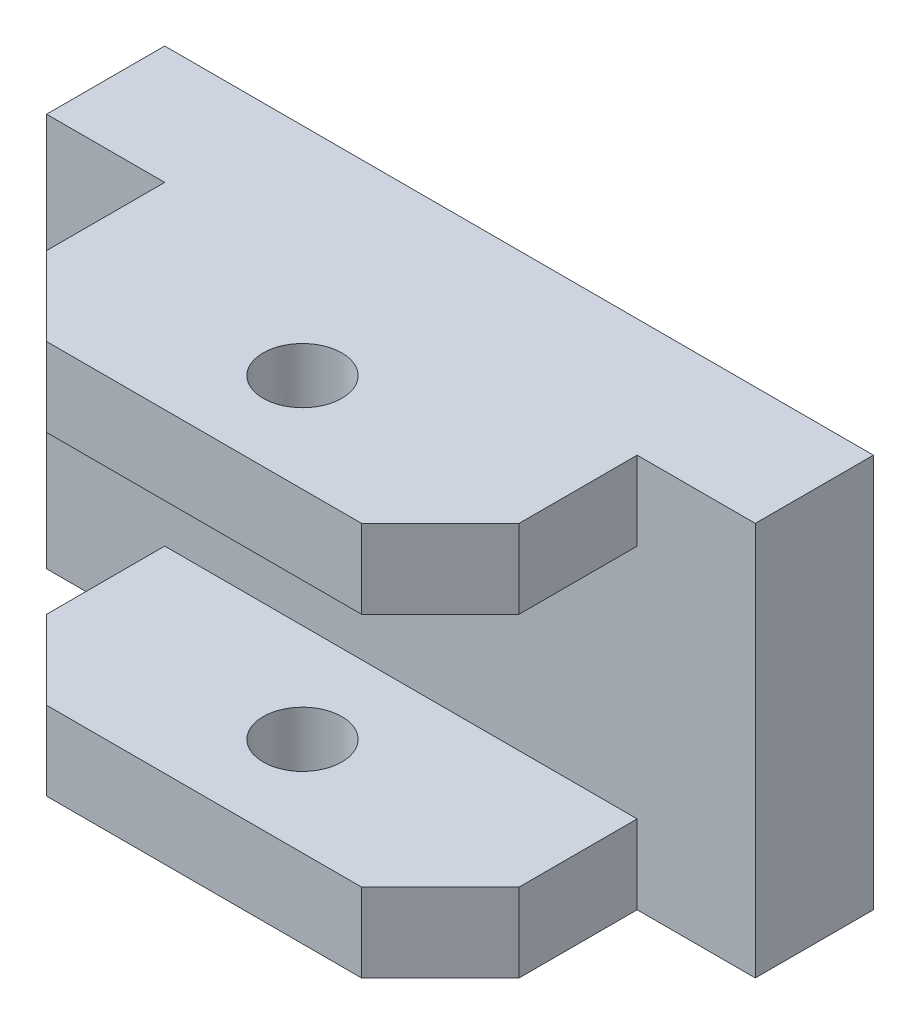
ISO-10303-21;
HEADER;
FILE_DESCRIPTION(('STEP AP214'),'2;1');
FILE_NAME('part.step','',(''),(''),'','','');
FILE_SCHEMA(('AUTOMOTIVE_DESIGN { 1 0 10303 214 1 1 1 1 }'));
ENDSEC;
DATA;
#1=APPLICATION_CONTEXT('core data for automotive mechanical design processes');
#2=APPLICATION_PROTOCOL_DEFINITION('international standard','automotive_design',2000,#1);
#3=PRODUCT_CONTEXT('',#1,'mechanical');
#4=PRODUCT('Part','Part','',(#3));
#5=PRODUCT_RELATED_PRODUCT_CATEGORY('part','',(#4));
#6=PRODUCT_DEFINITION_FORMATION('','',#4);
#7=PRODUCT_DEFINITION_CONTEXT('part definition',#1,'design');
#8=PRODUCT_DEFINITION('design','',#6,#7);
#9=PRODUCT_DEFINITION_SHAPE('','',#8);
#10=(LENGTH_UNIT() NAMED_UNIT(*) SI_UNIT(.MILLI.,.METRE.));
#11=(NAMED_UNIT(*) PLANE_ANGLE_UNIT() SI_UNIT($,.RADIAN.));
#12=(NAMED_UNIT(*) SI_UNIT($,.STERADIAN.) SOLID_ANGLE_UNIT());
#13=UNCERTAINTY_MEASURE_WITH_UNIT(LENGTH_MEASURE(1.E-05),#10,'distance_accuracy_value','');
#14=(GEOMETRIC_REPRESENTATION_CONTEXT(3) GLOBAL_UNCERTAINTY_ASSIGNED_CONTEXT((#13)) GLOBAL_UNIT_ASSIGNED_CONTEXT((#10,
#11,#12)) REPRESENTATION_CONTEXT('',''));
#15=CARTESIAN_POINT('',(0.,0.,0.));
#16=DIRECTION('',(0.,0.,1.));
#17=DIRECTION('',(1.,0.,0.));
#18=AXIS2_PLACEMENT_3D('',#15,#16,#17);
#19=CARTESIAN_POINT('',(0.,0.,15.));
#20=DIRECTION('',(0.,0.,-1.));
#21=DIRECTION('',(-1.,0.,0.));
#22=AXIS2_PLACEMENT_3D('',#19,#20,#21);
#23=PLANE('',#22);
#24=DIRECTION('',(0.,-1.,0.));
#25=VECTOR('',#24,1.);
#26=CARTESIAN_POINT('',(-30.,25.,15.));
#27=LINE('',#26,#25);
#28=CARTESIAN_POINT('',(-30.,25.,15.));
#29=VERTEX_POINT('',#28);
#30=CARTESIAN_POINT('',(-30.,15.,15.));
#31=VERTEX_POINT('',#30);
#32=EDGE_CURVE('E184',#29,#31,#27,.T.);
#33=ORIENTED_EDGE('',*,*,#32,.F.);
#34=DIRECTION('',(-1.,0.,0.));
#35=VECTOR('',#34,1.);
#36=CARTESIAN_POINT('',(-45.,25.,15.));
#37=LINE('',#36,#35);
#38=CARTESIAN_POINT('',(-45.,25.,15.));
#39=VERTEX_POINT('',#38);
#40=EDGE_CURVE('E221',#29,#39,#37,.T.);
#41=ORIENTED_EDGE('',*,*,#40,.T.);
#42=DIRECTION('',(0.,-1.,0.));
#43=VECTOR('',#42,1.);
#44=CARTESIAN_POINT('',(-45.,-25.,15.));
#45=LINE('',#44,#43);
#46=CARTESIAN_POINT('',(-45.,-25.,15.));
#47=VERTEX_POINT('',#46);
#48=EDGE_CURVE('E224',#39,#47,#45,.T.);
#49=ORIENTED_EDGE('',*,*,#48,.T.);
#50=DIRECTION('',(1.,0.,0.));
#51=VECTOR('',#50,1.);
#52=CARTESIAN_POINT('',(-45.,-25.,15.));
#53=LINE('',#52,#51);
#54=CARTESIAN_POINT('',(-30.,-25.,15.));
#55=VERTEX_POINT('',#54);
#56=EDGE_CURVE('E227',#47,#55,#53,.T.);
#57=ORIENTED_EDGE('',*,*,#56,.T.);
#58=DIRECTION('',(0.,-1.,0.));
#59=VECTOR('',#58,1.);
#60=CARTESIAN_POINT('',(-30.,-25.,15.));
#61=LINE('',#60,#59);
#62=CARTESIAN_POINT('',(-30.,-15.,15.));
#63=VERTEX_POINT('',#62);
#64=EDGE_CURVE('E206',#63,#55,#61,.T.);
#65=ORIENTED_EDGE('',*,*,#64,.F.);
#66=DIRECTION('',(-1.,0.,0.));
#67=VECTOR('',#66,1.);
#68=CARTESIAN_POINT('',(-30.,-15.,15.));
#69=LINE('',#68,#67);
#70=CARTESIAN_POINT('',(30.,-15.,15.));
#71=VERTEX_POINT('',#70);
#72=EDGE_CURVE('E209',#71,#63,#69,.T.);
#73=ORIENTED_EDGE('',*,*,#72,.F.);
#74=DIRECTION('',(0.,1.,0.));
#75=VECTOR('',#74,1.);
#76=CARTESIAN_POINT('',(30.,-15.,15.));
#77=LINE('',#76,#75);
#78=CARTESIAN_POINT('',(30.,-25.,15.));
#79=VERTEX_POINT('',#78);
#80=EDGE_CURVE('E186',#79,#71,#77,.T.);
#81=ORIENTED_EDGE('',*,*,#80,.F.);
#82=CARTESIAN_POINT('',(45.,-25.,15.));
#83=VERTEX_POINT('',#82);
#84=EDGE_CURVE('E226',#79,#83,#53,.T.);
#85=ORIENTED_EDGE('',*,*,#84,.T.);
#86=DIRECTION('',(0.,1.,0.));
#87=VECTOR('',#86,1.);
#88=CARTESIAN_POINT('',(45.,-25.,15.));
#89=LINE('',#88,#87);
#90=CARTESIAN_POINT('',(45.,25.,15.));
#91=VERTEX_POINT('',#90);
#92=EDGE_CURVE('E219',#83,#91,#89,.T.);
#93=ORIENTED_EDGE('',*,*,#92,.T.);
#94=CARTESIAN_POINT('',(30.,25.,15.));
#95=VERTEX_POINT('',#94);
#96=EDGE_CURVE('E178',#91,#95,#37,.T.);
#97=ORIENTED_EDGE('',*,*,#96,.T.);
#98=DIRECTION('',(0.,1.,0.));
#99=VECTOR('',#98,1.);
#100=CARTESIAN_POINT('',(30.,25.,15.));
#101=LINE('',#100,#99);
#102=CARTESIAN_POINT('',(30.,15.,15.));
#103=VERTEX_POINT('',#102);
#104=EDGE_CURVE('E163',#103,#95,#101,.T.);
#105=ORIENTED_EDGE('',*,*,#104,.F.);
#106=DIRECTION('',(1.,0.,0.));
#107=VECTOR('',#106,1.);
#108=CARTESIAN_POINT('',(-30.,15.,15.));
#109=LINE('',#108,#107);
#110=EDGE_CURVE('E175',#31,#103,#109,.T.);
#111=ORIENTED_EDGE('',*,*,#110,.F.);
#112=EDGE_LOOP('',(#33,#41,#49,#57,#65,#73,#81,#85,#93,#97,#105,#111));
#113=FACE_BOUND('',#112,.T.);
#114=ADVANCED_FACE('F45',(#113),#23,.F.);
#115=CARTESIAN_POINT('',(45.,-25.,15.));
#116=DIRECTION('',(-1.,0.,0.));
#117=DIRECTION('',(0.,0.,1.));
#118=AXIS2_PLACEMENT_3D('',#115,#116,#117);
#119=PLANE('',#118);
#120=DIRECTION('',(0.,1.,0.));
#121=VECTOR('',#120,1.);
#122=CARTESIAN_POINT('',(45.,-25.,0.));
#123=LINE('',#122,#121);
#124=CARTESIAN_POINT('',(45.,-25.,0.));
#125=VERTEX_POINT('',#124);
#126=CARTESIAN_POINT('',(45.,25.,0.));
#127=VERTEX_POINT('',#126);
#128=EDGE_CURVE('E195',#125,#127,#123,.T.);
#129=ORIENTED_EDGE('',*,*,#128,.T.);
#130=DIRECTION('',(0.,0.,-1.));
#131=VECTOR('',#130,1.);
#132=CARTESIAN_POINT('',(45.,25.,15.));
#133=LINE('',#132,#131);
#134=EDGE_CURVE('E246',#91,#127,#133,.T.);
#135=ORIENTED_EDGE('',*,*,#134,.F.);
#136=ORIENTED_EDGE('',*,*,#92,.F.);
#137=DIRECTION('',(0.,0.,-1.));
#138=VECTOR('',#137,1.);
#139=CARTESIAN_POINT('',(45.,-25.,15.));
#140=LINE('',#139,#138);
#141=EDGE_CURVE('E230',#83,#125,#140,.T.);
#142=ORIENTED_EDGE('',*,*,#141,.T.);
#143=EDGE_LOOP('',(#129,#135,#136,#142));
#144=FACE_BOUND('',#143,.T.);
#145=ADVANCED_FACE('F317',(#144),#119,.F.);
#146=CARTESIAN_POINT('',(-45.,25.,15.));
#147=DIRECTION('',(0.,-1.,0.));
#148=DIRECTION('',(0.,0.,-1.));
#149=AXIS2_PLACEMENT_3D('',#146,#147,#148);
#150=PLANE('',#149);
#151=CARTESIAN_POINT('',(0.,25.,27.5));
#152=DIRECTION('',(0.,-1.,0.));
#153=DIRECTION('',(0.,0.,-1.));
#154=AXIS2_PLACEMENT_3D('',#151,#152,#153);
#155=CIRCLE('',#154,5.);
#156=CARTESIAN_POINT('',(0.,25.,22.5));
#157=VERTEX_POINT('',#156);
#158=EDGE_CURVE('E253',#157,#157,#155,.T.);
#159=ORIENTED_EDGE('',*,*,#158,.T.);
#160=EDGE_LOOP('',(#159));
#161=FACE_BOUND('',#160,.T.);
#162=DIRECTION('',(0.,0.,-1.));
#163=VECTOR('',#162,1.);
#164=CARTESIAN_POINT('',(-30.,25.,40.));
#165=LINE('',#164,#163);
#166=CARTESIAN_POINT('',(-30.,25.,30.));
#167=VERTEX_POINT('',#166);
#168=EDGE_CURVE('E190',#167,#29,#165,.T.);
#169=ORIENTED_EDGE('',*,*,#168,.F.);
#170=DIRECTION('',(0.707106781186548,0.,0.707106781186548));
#171=VECTOR('',#170,1.);
#172=CARTESIAN_POINT('',(-20.,25.,40.));
#173=LINE('',#172,#171);
#174=CARTESIAN_POINT('',(-20.,25.,40.));
#175=VERTEX_POINT('',#174);
#176=EDGE_CURVE('E267',#167,#175,#173,.T.);
#177=ORIENTED_EDGE('',*,*,#176,.T.);
#178=DIRECTION('',(-1.,0.,0.));
#179=VECTOR('',#178,1.);
#180=CARTESIAN_POINT('',(-30.,25.,40.));
#181=LINE('',#180,#179);
#182=CARTESIAN_POINT('',(20.,25.,40.));
#183=VERTEX_POINT('',#182);
#184=EDGE_CURVE('E192',#183,#175,#181,.T.);
#185=ORIENTED_EDGE('',*,*,#184,.F.);
#186=DIRECTION('',(0.707106781186548,0.,-0.707106781186548));
#187=VECTOR('',#186,1.);
#188=CARTESIAN_POINT('',(20.,25.,40.));
#189=LINE('',#188,#187);
#190=CARTESIAN_POINT('',(30.,25.,30.));
#191=VERTEX_POINT('',#190);
#192=EDGE_CURVE('E265',#183,#191,#189,.T.);
#193=ORIENTED_EDGE('',*,*,#192,.T.);
#194=DIRECTION('',(0.,0.,-1.));
#195=VECTOR('',#194,1.);
#196=CARTESIAN_POINT('',(30.,25.,40.));
#197=LINE('',#196,#195);
#198=EDGE_CURVE('E169',#191,#95,#197,.T.);
#199=ORIENTED_EDGE('',*,*,#198,.T.);
#200=ORIENTED_EDGE('',*,*,#96,.F.);
#201=ORIENTED_EDGE('',*,*,#134,.T.);
#202=DIRECTION('',(-1.,0.,0.));
#203=VECTOR('',#202,1.);
#204=CARTESIAN_POINT('',(-45.,25.,0.));
#205=LINE('',#204,#203);
#206=CARTESIAN_POINT('',(-45.,25.,0.));
#207=VERTEX_POINT('',#206);
#208=EDGE_CURVE('E233',#127,#207,#205,.T.);
#209=ORIENTED_EDGE('',*,*,#208,.T.);
#210=DIRECTION('',(0.,0.,-1.));
#211=VECTOR('',#210,1.);
#212=CARTESIAN_POINT('',(-45.,25.,15.));
#213=LINE('',#212,#211);
#214=EDGE_CURVE('E243',#39,#207,#213,.T.);
#215=ORIENTED_EDGE('',*,*,#214,.F.);
#216=ORIENTED_EDGE('',*,*,#40,.F.);
#217=EDGE_LOOP('',(#169,#177,#185,#193,#199,#200,#201,#209,#215,#216));
#218=FACE_BOUND('',#217,.T.);
#219=ADVANCED_FACE('F321',(#161,#218),#150,.F.);
#220=CARTESIAN_POINT('',(-45.,-25.,15.));
#221=DIRECTION('',(1.,0.,0.));
#222=DIRECTION('',(0.,0.,-1.));
#223=AXIS2_PLACEMENT_3D('',#220,#221,#222);
#224=PLANE('',#223);
#225=DIRECTION('',(0.,-1.,0.));
#226=VECTOR('',#225,1.);
#227=CARTESIAN_POINT('',(-45.,-25.,0.));
#228=LINE('',#227,#226);
#229=CARTESIAN_POINT('',(-45.,-25.,0.));
#230=VERTEX_POINT('',#229);
#231=EDGE_CURVE('E235',#207,#230,#228,.T.);
#232=ORIENTED_EDGE('',*,*,#231,.T.);
#233=DIRECTION('',(0.,0.,-1.));
#234=VECTOR('',#233,1.);
#235=CARTESIAN_POINT('',(-45.,-25.,15.));
#236=LINE('',#235,#234);
#237=EDGE_CURVE('E240',#47,#230,#236,.T.);
#238=ORIENTED_EDGE('',*,*,#237,.F.);
#239=ORIENTED_EDGE('',*,*,#48,.F.);
#240=ORIENTED_EDGE('',*,*,#214,.T.);
#241=EDGE_LOOP('',(#232,#238,#239,#240));
#242=FACE_BOUND('',#241,.T.);
#243=ADVANCED_FACE('F372',(#242),#224,.F.);
#244=CARTESIAN_POINT('',(-45.,-25.,15.));
#245=DIRECTION('',(0.,1.,0.));
#246=DIRECTION('',(0.,0.,1.));
#247=AXIS2_PLACEMENT_3D('',#244,#245,#246);
#248=PLANE('',#247);
#249=CARTESIAN_POINT('',(0.,-25.,27.5));
#250=DIRECTION('',(0.,-1.,0.));
#251=DIRECTION('',(0.,0.,-1.));
#252=AXIS2_PLACEMENT_3D('',#249,#250,#251);
#253=CIRCLE('',#252,5.);
#254=CARTESIAN_POINT('',(0.,-25.,22.5));
#255=VERTEX_POINT('',#254);
#256=EDGE_CURVE('E335',#255,#255,#253,.T.);
#257=ORIENTED_EDGE('',*,*,#256,.F.);
#258=EDGE_LOOP('',(#257));
#259=FACE_BOUND('',#258,.T.);
#260=DIRECTION('',(1.,0.,0.));
#261=VECTOR('',#260,1.);
#262=CARTESIAN_POINT('',(30.,-25.,40.));
#263=LINE('',#262,#261);
#264=CARTESIAN_POINT('',(-20.,-25.,40.));
#265=VERTEX_POINT('',#264);
#266=CARTESIAN_POINT('',(20.,-25.,40.));
#267=VERTEX_POINT('',#266);
#268=EDGE_CURVE('E210',#265,#267,#263,.T.);
#269=ORIENTED_EDGE('',*,*,#268,.F.);
#270=DIRECTION('',(0.707106781186548,0.,0.707106781186548));
#271=VECTOR('',#270,1.);
#272=CARTESIAN_POINT('',(-20.,-25.,40.));
#273=LINE('',#272,#271);
#274=CARTESIAN_POINT('',(-30.,-25.,30.));
#275=VERTEX_POINT('',#274);
#276=EDGE_CURVE('E277',#265,#275,#273,.F.);
#277=ORIENTED_EDGE('',*,*,#276,.T.);
#278=DIRECTION('',(0.,0.,-1.));
#279=VECTOR('',#278,1.);
#280=CARTESIAN_POINT('',(-30.,-25.,40.));
#281=LINE('',#280,#279);
#282=EDGE_CURVE('E203',#275,#55,#281,.T.);
#283=ORIENTED_EDGE('',*,*,#282,.T.);
#284=ORIENTED_EDGE('',*,*,#56,.F.);
#285=ORIENTED_EDGE('',*,*,#237,.T.);
#286=DIRECTION('',(1.,0.,0.));
#287=VECTOR('',#286,1.);
#288=CARTESIAN_POINT('',(-45.,-25.,0.));
#289=LINE('',#288,#287);
#290=EDGE_CURVE('E222',#230,#125,#289,.T.);
#291=ORIENTED_EDGE('',*,*,#290,.T.);
#292=ORIENTED_EDGE('',*,*,#141,.F.);
#293=ORIENTED_EDGE('',*,*,#84,.F.);
#294=DIRECTION('',(0.,0.,-1.));
#295=VECTOR('',#294,1.);
#296=CARTESIAN_POINT('',(30.,-25.,40.));
#297=LINE('',#296,#295);
#298=CARTESIAN_POINT('',(30.,-25.,30.));
#299=VERTEX_POINT('',#298);
#300=EDGE_CURVE('E196',#299,#79,#297,.T.);
#301=ORIENTED_EDGE('',*,*,#300,.F.);
#302=DIRECTION('',(0.707106781186547,0.,-0.707106781186548));
#303=VECTOR('',#302,1.);
#304=CARTESIAN_POINT('',(20.,-25.,40.));
#305=LINE('',#304,#303);
#306=EDGE_CURVE('E275',#299,#267,#305,.F.);
#307=ORIENTED_EDGE('',*,*,#306,.T.);
#308=EDGE_LOOP('',(#269,#277,#283,#284,#285,#291,#292,#293,#301,#307));
#309=FACE_BOUND('',#308,.T.);
#310=ADVANCED_FACE('F292',(#259,#309),#248,.F.);
#311=CARTESIAN_POINT('',(0.,0.,0.));
#312=DIRECTION('',(0.,0.,-1.));
#313=DIRECTION('',(-1.,0.,0.));
#314=AXIS2_PLACEMENT_3D('',#311,#312,#313);
#315=PLANE('',#314);
#316=ORIENTED_EDGE('',*,*,#128,.F.);
#317=ORIENTED_EDGE('',*,*,#290,.F.);
#318=ORIENTED_EDGE('',*,*,#231,.F.);
#319=ORIENTED_EDGE('',*,*,#208,.F.);
#320=EDGE_LOOP('',(#316,#317,#318,#319));
#321=FACE_BOUND('',#320,.T.);
#322=ADVANCED_FACE('F314',(#321),#315,.T.);
#323=CARTESIAN_POINT('',(30.,-15.,40.));
#324=DIRECTION('',(-1.,0.,0.));
#325=DIRECTION('',(0.,-1.,0.));
#326=AXIS2_PLACEMENT_3D('',#323,#324,#325);
#327=PLANE('',#326);
#328=DIRECTION('',(0.,0.,-1.));
#329=VECTOR('',#328,1.);
#330=CARTESIAN_POINT('',(30.,-15.,40.));
#331=LINE('',#330,#329);
#332=CARTESIAN_POINT('',(30.,-15.,30.));
#333=VERTEX_POINT('',#332);
#334=EDGE_CURVE('E198',#333,#71,#331,.T.);
#335=ORIENTED_EDGE('',*,*,#334,.F.);
#336=DIRECTION('',(0.,-1.,0.));
#337=VECTOR('',#336,1.);
#338=CARTESIAN_POINT('',(30.,-15.,30.));
#339=LINE('',#338,#337);
#340=EDGE_CURVE('E54',#333,#299,#339,.T.);
#341=ORIENTED_EDGE('',*,*,#340,.T.);
#342=ORIENTED_EDGE('',*,*,#300,.T.);
#343=ORIENTED_EDGE('',*,*,#80,.T.);
#344=EDGE_LOOP('',(#335,#341,#342,#343));
#345=FACE_BOUND('',#344,.T.);
#346=ADVANCED_FACE('F285',(#345),#327,.F.);
#347=CARTESIAN_POINT('',(-30.,-15.,40.));
#348=DIRECTION('',(0.,-1.,0.));
#349=DIRECTION('',(0.,0.,-1.));
#350=AXIS2_PLACEMENT_3D('',#347,#348,#349);
#351=PLANE('',#350);
#352=CARTESIAN_POINT('',(0.,-15.,27.5));
#353=DIRECTION('',(0.,-1.,0.));
#354=DIRECTION('',(0.,0.,-1.));
#355=AXIS2_PLACEMENT_3D('',#352,#353,#354);
#356=CIRCLE('',#355,5.);
#357=CARTESIAN_POINT('',(0.,-15.,22.5));
#358=VERTEX_POINT('',#357);
#359=EDGE_CURVE('E199',#358,#358,#356,.T.);
#360=ORIENTED_EDGE('',*,*,#359,.T.);
#361=EDGE_LOOP('',(#360));
#362=FACE_BOUND('',#361,.T.);
#363=DIRECTION('',(0.,0.,-1.));
#364=VECTOR('',#363,1.);
#365=CARTESIAN_POINT('',(-30.,-15.,40.));
#366=LINE('',#365,#364);
#367=CARTESIAN_POINT('',(-30.,-15.,30.));
#368=VERTEX_POINT('',#367);
#369=EDGE_CURVE('E201',#368,#63,#366,.T.);
#370=ORIENTED_EDGE('',*,*,#369,.F.);
#371=DIRECTION('',(-0.707106781186548,0.,-0.707106781186548));
#372=VECTOR('',#371,1.);
#373=CARTESIAN_POINT('',(-20.,-15.,40.));
#374=LINE('',#373,#372);
#375=CARTESIAN_POINT('',(-20.,-15.,40.));
#376=VERTEX_POINT('',#375);
#377=EDGE_CURVE('E281',#368,#376,#374,.F.);
#378=ORIENTED_EDGE('',*,*,#377,.T.);
#379=DIRECTION('',(-1.,0.,0.));
#380=VECTOR('',#379,1.);
#381=CARTESIAN_POINT('',(-30.,-15.,40.));
#382=LINE('',#381,#380);
#383=CARTESIAN_POINT('',(20.,-15.,40.));
#384=VERTEX_POINT('',#383);
#385=EDGE_CURVE('E205',#384,#376,#382,.T.);
#386=ORIENTED_EDGE('',*,*,#385,.F.);
#387=DIRECTION('',(-0.707106781186547,0.,0.707106781186548));
#388=VECTOR('',#387,1.);
#389=CARTESIAN_POINT('',(20.,-15.,40.));
#390=LINE('',#389,#388);
#391=EDGE_CURVE('E61',#384,#333,#390,.F.);
#392=ORIENTED_EDGE('',*,*,#391,.T.);
#393=ORIENTED_EDGE('',*,*,#334,.T.);
#394=ORIENTED_EDGE('',*,*,#72,.T.);
#395=EDGE_LOOP('',(#370,#378,#386,#392,#393,#394));
#396=FACE_BOUND('',#395,.T.);
#397=ADVANCED_FACE('F299',(#362,#396),#351,.F.);
#398=CARTESIAN_POINT('',(-30.,-25.,40.));
#399=DIRECTION('',(1.,0.,0.));
#400=DIRECTION('',(0.,0.,-1.));
#401=AXIS2_PLACEMENT_3D('',#398,#399,#400);
#402=PLANE('',#401);
#403=ORIENTED_EDGE('',*,*,#282,.F.);
#404=DIRECTION('',(0.,1.,0.));
#405=VECTOR('',#404,1.);
#406=CARTESIAN_POINT('',(-30.,-25.,30.));
#407=LINE('',#406,#405);
#408=EDGE_CURVE('E69',#275,#368,#407,.T.);
#409=ORIENTED_EDGE('',*,*,#408,.T.);
#410=ORIENTED_EDGE('',*,*,#369,.T.);
#411=ORIENTED_EDGE('',*,*,#64,.T.);
#412=EDGE_LOOP('',(#403,#409,#410,#411));
#413=FACE_BOUND('',#412,.T.);
#414=ADVANCED_FACE('F304',(#413),#402,.F.);
#415=CARTESIAN_POINT('',(0.,0.,40.));
#416=DIRECTION('',(0.,0.,-1.));
#417=DIRECTION('',(-1.,0.,0.));
#418=AXIS2_PLACEMENT_3D('',#415,#416,#417);
#419=PLANE('',#418);
#420=ORIENTED_EDGE('',*,*,#385,.T.);
#421=DIRECTION('',(0.,-1.,0.));
#422=VECTOR('',#421,1.);
#423=CARTESIAN_POINT('',(-20.,0.,40.));
#424=LINE('',#423,#422);
#425=EDGE_CURVE('E272',#376,#265,#424,.T.);
#426=ORIENTED_EDGE('',*,*,#425,.T.);
#427=ORIENTED_EDGE('',*,*,#268,.T.);
#428=DIRECTION('',(0.,1.,0.));
#429=VECTOR('',#428,1.);
#430=CARTESIAN_POINT('',(20.,0.,40.));
#431=LINE('',#430,#429);
#432=EDGE_CURVE('E269',#267,#384,#431,.T.);
#433=ORIENTED_EDGE('',*,*,#432,.T.);
#434=EDGE_LOOP('',(#420,#426,#427,#433));
#435=FACE_BOUND('',#434,.T.);
#436=ADVANCED_FACE('F297',(#435),#419,.F.);
#437=CARTESIAN_POINT('',(-30.,25.,40.));
#438=DIRECTION('',(1.,0.,0.));
#439=DIRECTION('',(0.,1.,0.));
#440=AXIS2_PLACEMENT_3D('',#437,#438,#439);
#441=PLANE('',#440);
#442=DIRECTION('',(0.,0.,-1.));
#443=VECTOR('',#442,1.);
#444=CARTESIAN_POINT('',(-30.,15.,40.));
#445=LINE('',#444,#443);
#446=CARTESIAN_POINT('',(-30.,15.,30.));
#447=VERTEX_POINT('',#446);
#448=EDGE_CURVE('E168',#447,#31,#445,.T.);
#449=ORIENTED_EDGE('',*,*,#448,.F.);
#450=DIRECTION('',(0.,1.,0.));
#451=VECTOR('',#450,1.);
#452=CARTESIAN_POINT('',(-30.,25.,30.));
#453=LINE('',#452,#451);
#454=EDGE_CURVE('E263',#447,#167,#453,.T.);
#455=ORIENTED_EDGE('',*,*,#454,.T.);
#456=ORIENTED_EDGE('',*,*,#168,.T.);
#457=ORIENTED_EDGE('',*,*,#32,.T.);
#458=EDGE_LOOP('',(#449,#455,#456,#457));
#459=FACE_BOUND('',#458,.T.);
#460=ADVANCED_FACE('F350',(#459),#441,.F.);
#461=CARTESIAN_POINT('',(-30.,15.,40.));
#462=DIRECTION('',(0.,1.,0.));
#463=DIRECTION('',(0.,0.,1.));
#464=AXIS2_PLACEMENT_3D('',#461,#462,#463);
#465=PLANE('',#464);
#466=CARTESIAN_POINT('',(0.,15.,27.5));
#467=DIRECTION('',(0.,1.,0.));
#468=DIRECTION('',(0.,0.,1.));
#469=AXIS2_PLACEMENT_3D('',#466,#467,#468);
#470=CIRCLE('',#469,5.);
#471=CARTESIAN_POINT('',(0.,15.,32.5));
#472=VERTEX_POINT('',#471);
#473=EDGE_CURVE('E250',#472,#472,#470,.T.);
#474=ORIENTED_EDGE('',*,*,#473,.T.);
#475=EDGE_LOOP('',(#474));
#476=FACE_BOUND('',#475,.T.);
#477=DIRECTION('',(1.,0.,0.));
#478=VECTOR('',#477,1.);
#479=CARTESIAN_POINT('',(-30.,15.,40.));
#480=LINE('',#479,#478);
#481=CARTESIAN_POINT('',(-20.,15.,40.));
#482=VERTEX_POINT('',#481);
#483=CARTESIAN_POINT('',(20.,15.,40.));
#484=VERTEX_POINT('',#483);
#485=EDGE_CURVE('E179',#482,#484,#480,.T.);
#486=ORIENTED_EDGE('',*,*,#485,.F.);
#487=DIRECTION('',(-0.707106781186548,0.,-0.707106781186548));
#488=VECTOR('',#487,1.);
#489=CARTESIAN_POINT('',(-20.,15.,40.));
#490=LINE('',#489,#488);
#491=EDGE_CURVE('E261',#482,#447,#490,.T.);
#492=ORIENTED_EDGE('',*,*,#491,.T.);
#493=ORIENTED_EDGE('',*,*,#448,.T.);
#494=ORIENTED_EDGE('',*,*,#110,.T.);
#495=DIRECTION('',(0.,0.,-1.));
#496=VECTOR('',#495,1.);
#497=CARTESIAN_POINT('',(30.,15.,40.));
#498=LINE('',#497,#496);
#499=CARTESIAN_POINT('',(30.,15.,30.));
#500=VERTEX_POINT('',#499);
#501=EDGE_CURVE('E159',#500,#103,#498,.T.);
#502=ORIENTED_EDGE('',*,*,#501,.F.);
#503=DIRECTION('',(-0.707106781186548,0.,0.707106781186548));
#504=VECTOR('',#503,1.);
#505=CARTESIAN_POINT('',(20.,15.,40.));
#506=LINE('',#505,#504);
#507=EDGE_CURVE('E259',#500,#484,#506,.T.);
#508=ORIENTED_EDGE('',*,*,#507,.T.);
#509=EDGE_LOOP('',(#486,#492,#493,#494,#502,#508));
#510=FACE_BOUND('',#509,.T.);
#511=ADVANCED_FACE('F182',(#476,#510),#465,.F.);
#512=CARTESIAN_POINT('',(30.,25.,40.));
#513=DIRECTION('',(-1.,0.,0.));
#514=DIRECTION('',(0.,0.,1.));
#515=AXIS2_PLACEMENT_3D('',#512,#513,#514);
#516=PLANE('',#515);
#517=ORIENTED_EDGE('',*,*,#198,.F.);
#518=DIRECTION('',(0.,-1.,0.));
#519=VECTOR('',#518,1.);
#520=CARTESIAN_POINT('',(30.,15.,30.));
#521=LINE('',#520,#519);
#522=EDGE_CURVE('E13',#191,#500,#521,.T.);
#523=ORIENTED_EDGE('',*,*,#522,.T.);
#524=ORIENTED_EDGE('',*,*,#501,.T.);
#525=ORIENTED_EDGE('',*,*,#104,.T.);
#526=EDGE_LOOP('',(#517,#523,#524,#525));
#527=FACE_BOUND('',#526,.T.);
#528=ADVANCED_FACE('F162',(#527),#516,.F.);
#529=CARTESIAN_POINT('',(0.,0.,40.));
#530=DIRECTION('',(0.,0.,1.));
#531=DIRECTION('',(1.,0.,0.));
#532=AXIS2_PLACEMENT_3D('',#529,#530,#531);
#533=PLANE('',#532);
#534=ORIENTED_EDGE('',*,*,#184,.T.);
#535=DIRECTION('',(0.,-1.,0.));
#536=VECTOR('',#535,1.);
#537=CARTESIAN_POINT('',(-20.,15.,40.));
#538=LINE('',#537,#536);
#539=EDGE_CURVE('E256',#175,#482,#538,.T.);
#540=ORIENTED_EDGE('',*,*,#539,.T.);
#541=ORIENTED_EDGE('',*,*,#485,.T.);
#542=DIRECTION('',(0.,1.,0.));
#543=VECTOR('',#542,1.);
#544=CARTESIAN_POINT('',(20.,25.,40.));
#545=LINE('',#544,#543);
#546=EDGE_CURVE('E249',#484,#183,#545,.T.);
#547=ORIENTED_EDGE('',*,*,#546,.T.);
#548=EDGE_LOOP('',(#534,#540,#541,#547));
#549=FACE_BOUND('',#548,.T.);
#550=ADVANCED_FACE('F329',(#549),#533,.T.);
#551=CARTESIAN_POINT('',(0.,25.,27.5));
#552=DIRECTION('',(0.,-1.,0.));
#553=DIRECTION('',(0.,0.,-1.));
#554=AXIS2_PLACEMENT_3D('',#551,#552,#553);
#555=CYLINDRICAL_SURFACE('',#554,5.);
#556=ORIENTED_EDGE('',*,*,#158,.F.);
#557=EDGE_LOOP('',(#556));
#558=FACE_BOUND('',#557,.T.);
#559=ORIENTED_EDGE('',*,*,#473,.F.);
#560=EDGE_LOOP('',(#559));
#561=FACE_BOUND('',#560,.T.);
#562=ADVANCED_FACE('F342',(#558,#561),#555,.F.);
#563=ORIENTED_EDGE('',*,*,#256,.T.);
#564=EDGE_LOOP('',(#563));
#565=FACE_BOUND('',#564,.T.);
#566=ORIENTED_EDGE('',*,*,#359,.F.);
#567=EDGE_LOOP('',(#566));
#568=FACE_BOUND('',#567,.T.);
#569=ADVANCED_FACE('F345',(#565,#568),#555,.F.);
#570=CARTESIAN_POINT('',(-20.,0.,40.));
#571=DIRECTION('',(-0.707106781186548,0.,0.707106781186548));
#572=DIRECTION('',(0.,1.,0.));
#573=AXIS2_PLACEMENT_3D('',#570,#571,#572);
#574=PLANE('',#573);
#575=ORIENTED_EDGE('',*,*,#176,.F.);
#576=ORIENTED_EDGE('',*,*,#454,.F.);
#577=ORIENTED_EDGE('',*,*,#491,.F.);
#578=ORIENTED_EDGE('',*,*,#539,.F.);
#579=EDGE_LOOP('',(#575,#576,#577,#578));
#580=FACE_BOUND('',#579,.T.);
#581=ADVANCED_FACE('F379',(#580),#574,.T.);
#582=CARTESIAN_POINT('',(-20.,0.,40.));
#583=DIRECTION('',(0.707106781186548,0.,-0.707106781186548));
#584=DIRECTION('',(0.,-1.,0.));
#585=AXIS2_PLACEMENT_3D('',#582,#583,#584);
#586=PLANE('',#585);
#587=ORIENTED_EDGE('',*,*,#377,.F.);
#588=ORIENTED_EDGE('',*,*,#408,.F.);
#589=ORIENTED_EDGE('',*,*,#276,.F.);
#590=ORIENTED_EDGE('',*,*,#425,.F.);
#591=EDGE_LOOP('',(#587,#588,#589,#590));
#592=FACE_BOUND('',#591,.T.);
#593=ADVANCED_FACE('F302',(#592),#586,.F.);
#594=CARTESIAN_POINT('',(20.,0.,40.));
#595=DIRECTION('',(-0.707106781186548,0.,-0.707106781186547));
#596=DIRECTION('',(0.,1.,0.));
#597=AXIS2_PLACEMENT_3D('',#594,#595,#596);
#598=PLANE('',#597);
#599=ORIENTED_EDGE('',*,*,#306,.F.);
#600=ORIENTED_EDGE('',*,*,#340,.F.);
#601=ORIENTED_EDGE('',*,*,#391,.F.);
#602=ORIENTED_EDGE('',*,*,#432,.F.);
#603=EDGE_LOOP('',(#599,#600,#601,#602));
#604=FACE_BOUND('',#603,.T.);
#605=ADVANCED_FACE('F295',(#604),#598,.F.);
#606=CARTESIAN_POINT('',(20.,0.,40.));
#607=DIRECTION('',(0.707106781186548,0.,0.707106781186548));
#608=DIRECTION('',(0.,-1.,0.));
#609=AXIS2_PLACEMENT_3D('',#606,#607,#608);
#610=PLANE('',#609);
#611=ORIENTED_EDGE('',*,*,#507,.F.);
#612=ORIENTED_EDGE('',*,*,#522,.F.);
#613=ORIENTED_EDGE('',*,*,#192,.F.);
#614=ORIENTED_EDGE('',*,*,#546,.F.);
#615=EDGE_LOOP('',(#611,#612,#613,#614));
#616=FACE_BOUND('',#615,.T.);
#617=ADVANCED_FACE('F48',(#616),#610,.T.);
#618=CLOSED_SHELL('',(#114,#145,#219,#243,#310,#322,#346,#397,#414,#436,#460,#511,#528,#550,
#562,#569,#581,#593,#605,#617));
#619=MANIFOLD_SOLID_BREP('B2',#618);
#620=ADVANCED_BREP_SHAPE_REPRESENTATION('',(#18,#619),#14);
#621=SHAPE_DEFINITION_REPRESENTATION(#9,#620);
ENDSEC;
END-ISO-10303-21;
